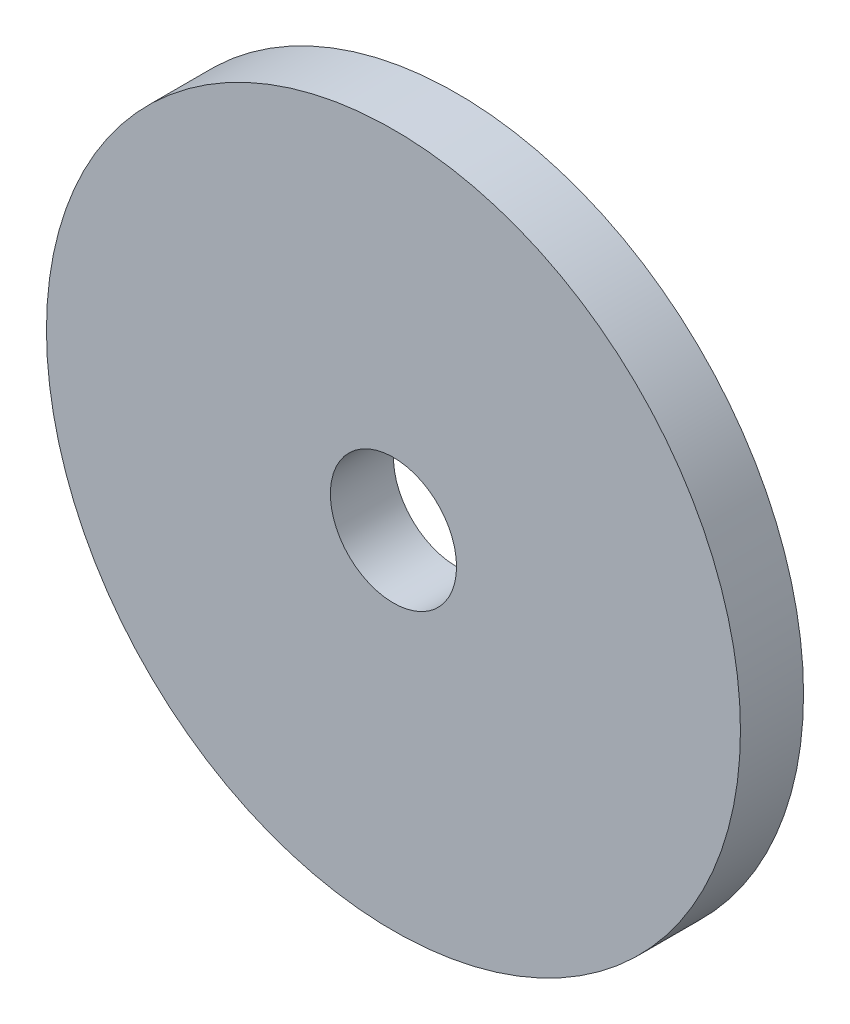
ISO-10303-21;
HEADER;
FILE_DESCRIPTION(('STEP AP214'),'2;1');
FILE_NAME('part.step','',(''),(''),'','','');
FILE_SCHEMA(('AUTOMOTIVE_DESIGN { 1 0 10303 214 1 1 1 1 }'));
ENDSEC;
DATA;
#1=APPLICATION_CONTEXT('core data for automotive mechanical design processes');
#2=APPLICATION_PROTOCOL_DEFINITION('international standard','automotive_design',2000,#1);
#3=PRODUCT_CONTEXT('',#1,'mechanical');
#4=PRODUCT('Part','Part','',(#3));
#5=PRODUCT_RELATED_PRODUCT_CATEGORY('part','',(#4));
#6=PRODUCT_DEFINITION_FORMATION('','',#4);
#7=PRODUCT_DEFINITION_CONTEXT('part definition',#1,'design');
#8=PRODUCT_DEFINITION('design','',#6,#7);
#9=PRODUCT_DEFINITION_SHAPE('','',#8);
#10=(LENGTH_UNIT() NAMED_UNIT(*) SI_UNIT(.MILLI.,.METRE.));
#11=(NAMED_UNIT(*) PLANE_ANGLE_UNIT() SI_UNIT($,.RADIAN.));
#12=(NAMED_UNIT(*) SI_UNIT($,.STERADIAN.) SOLID_ANGLE_UNIT());
#13=UNCERTAINTY_MEASURE_WITH_UNIT(LENGTH_MEASURE(1.E-05),#10,'distance_accuracy_value','');
#14=(GEOMETRIC_REPRESENTATION_CONTEXT(3) GLOBAL_UNCERTAINTY_ASSIGNED_CONTEXT((#13)) GLOBAL_UNIT_ASSIGNED_CONTEXT((#10,
#11,#12)) REPRESENTATION_CONTEXT('',''));
#15=CARTESIAN_POINT('',(0.,0.,0.));
#16=DIRECTION('',(0.,0.,1.));
#17=DIRECTION('',(1.,0.,0.));
#18=AXIS2_PLACEMENT_3D('',#15,#16,#17);
#19=CARTESIAN_POINT('',(0.,0.,2.));
#20=DIRECTION('',(0.,0.,1.));
#21=DIRECTION('',(1.,0.,0.));
#22=AXIS2_PLACEMENT_3D('',#19,#20,#21);
#23=PLANE('',#22);
#24=CARTESIAN_POINT('',(0.,0.,2.));
#25=DIRECTION('',(0.,0.,1.));
#26=DIRECTION('',(1.,0.,0.));
#27=AXIS2_PLACEMENT_3D('',#24,#25,#26);
#28=CIRCLE('',#27,11.);
#29=CARTESIAN_POINT('',(11.,0.,2.));
#30=VERTEX_POINT('',#29);
#31=EDGE_CURVE('E10',#30,#30,#28,.T.);
#32=ORIENTED_EDGE('',*,*,#31,.T.);
#33=EDGE_LOOP('',(#32));
#34=FACE_BOUND('',#33,.T.);
#35=CARTESIAN_POINT('',(0.,0.,2.));
#36=DIRECTION('',(0.,0.,1.));
#37=DIRECTION('',(1.,0.,0.));
#38=AXIS2_PLACEMENT_3D('',#35,#36,#37);
#39=CIRCLE('',#38,2.);
#40=CARTESIAN_POINT('',(2.,0.,2.));
#41=VERTEX_POINT('',#40);
#42=EDGE_CURVE('E43',#41,#41,#39,.T.);
#43=ORIENTED_EDGE('',*,*,#42,.F.);
#44=EDGE_LOOP('',(#43));
#45=FACE_BOUND('',#44,.T.);
#46=ADVANCED_FACE('F32',(#34,#45),#23,.T.);
#47=CARTESIAN_POINT('',(0.,0.,0.));
#48=DIRECTION('',(0.,0.,1.));
#49=DIRECTION('',(1.,0.,0.));
#50=AXIS2_PLACEMENT_3D('',#47,#48,#49);
#51=PLANE('',#50);
#52=CARTESIAN_POINT('',(0.,0.,0.));
#53=DIRECTION('',(0.,0.,1.));
#54=DIRECTION('',(1.,0.,0.));
#55=AXIS2_PLACEMENT_3D('',#52,#53,#54);
#56=CIRCLE('',#55,11.);
#57=CARTESIAN_POINT('',(11.,0.,0.));
#58=VERTEX_POINT('',#57);
#59=EDGE_CURVE('E36',#58,#58,#56,.T.);
#60=ORIENTED_EDGE('',*,*,#59,.F.);
#61=EDGE_LOOP('',(#60));
#62=FACE_BOUND('',#61,.T.);
#63=CARTESIAN_POINT('',(0.,0.,0.));
#64=DIRECTION('',(0.,0.,1.));
#65=DIRECTION('',(1.,0.,0.));
#66=AXIS2_PLACEMENT_3D('',#63,#64,#65);
#67=CIRCLE('',#66,2.);
#68=CARTESIAN_POINT('',(2.,0.,0.));
#69=VERTEX_POINT('',#68);
#70=EDGE_CURVE('E45',#69,#69,#67,.T.);
#71=ORIENTED_EDGE('',*,*,#70,.T.);
#72=EDGE_LOOP('',(#71));
#73=FACE_BOUND('',#72,.T.);
#74=ADVANCED_FACE('F55',(#62,#73),#51,.F.);
#75=CARTESIAN_POINT('',(0.,0.,2.));
#76=DIRECTION('',(0.,0.,-1.));
#77=DIRECTION('',(-1.,0.,0.));
#78=AXIS2_PLACEMENT_3D('',#75,#76,#77);
#79=CYLINDRICAL_SURFACE('',#78,11.);
#80=ORIENTED_EDGE('',*,*,#31,.F.);
#81=EDGE_LOOP('',(#80));
#82=FACE_BOUND('',#81,.T.);
#83=ORIENTED_EDGE('',*,*,#59,.T.);
#84=EDGE_LOOP('',(#83));
#85=FACE_BOUND('',#84,.T.);
#86=ADVANCED_FACE('F34',(#82,#85),#79,.T.);
#87=CARTESIAN_POINT('',(0.,0.,2.));
#88=DIRECTION('',(0.,0.,-1.));
#89=DIRECTION('',(-1.,0.,0.));
#90=AXIS2_PLACEMENT_3D('',#87,#88,#89);
#91=CYLINDRICAL_SURFACE('',#90,2.);
#92=ORIENTED_EDGE('',*,*,#42,.T.);
#93=EDGE_LOOP('',(#92));
#94=FACE_BOUND('',#93,.T.);
#95=ORIENTED_EDGE('',*,*,#70,.F.);
#96=EDGE_LOOP('',(#95));
#97=FACE_BOUND('',#96,.T.);
#98=ADVANCED_FACE('F51',(#94,#97),#91,.F.);
#99=CLOSED_SHELL('',(#46,#74,#86,#98));
#100=MANIFOLD_SOLID_BREP('B2',#99);
#101=ADVANCED_BREP_SHAPE_REPRESENTATION('',(#18,#100),#14);
#102=SHAPE_DEFINITION_REPRESENTATION(#9,#101);
ENDSEC;
END-ISO-10303-21;
